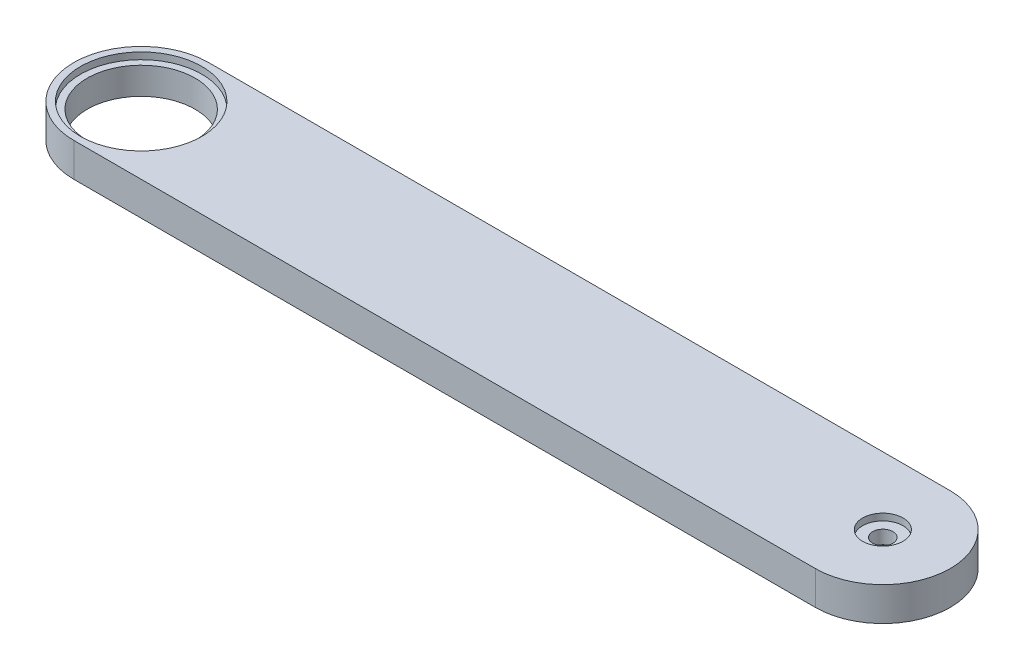
ISO-10303-21;
HEADER;
FILE_DESCRIPTION(('STEP AP214'),'2;1');
FILE_NAME('part.step','',(''),(''),'','','');
FILE_SCHEMA(('AUTOMOTIVE_DESIGN { 1 0 10303 214 1 1 1 1 }'));
ENDSEC;
DATA;
#1=APPLICATION_CONTEXT('core data for automotive mechanical design processes');
#2=APPLICATION_PROTOCOL_DEFINITION('international standard','automotive_design',2000,#1);
#3=PRODUCT_CONTEXT('',#1,'mechanical');
#4=PRODUCT('Part','Part','',(#3));
#5=PRODUCT_RELATED_PRODUCT_CATEGORY('part','',(#4));
#6=PRODUCT_DEFINITION_FORMATION('','',#4);
#7=PRODUCT_DEFINITION_CONTEXT('part definition',#1,'design');
#8=PRODUCT_DEFINITION('design','',#6,#7);
#9=PRODUCT_DEFINITION_SHAPE('','',#8);
#10=(LENGTH_UNIT() NAMED_UNIT(*) SI_UNIT(.MILLI.,.METRE.));
#11=(NAMED_UNIT(*) PLANE_ANGLE_UNIT() SI_UNIT($,.RADIAN.));
#12=(NAMED_UNIT(*) SI_UNIT($,.STERADIAN.) SOLID_ANGLE_UNIT());
#13=UNCERTAINTY_MEASURE_WITH_UNIT(LENGTH_MEASURE(1.E-05),#10,'distance_accuracy_value','');
#14=(GEOMETRIC_REPRESENTATION_CONTEXT(3) GLOBAL_UNCERTAINTY_ASSIGNED_CONTEXT((#13)) GLOBAL_UNIT_ASSIGNED_CONTEXT((#10,
#11,#12)) REPRESENTATION_CONTEXT('',''));
#15=CARTESIAN_POINT('',(0.,0.,0.));
#16=DIRECTION('',(0.,0.,1.));
#17=DIRECTION('',(1.,0.,0.));
#18=AXIS2_PLACEMENT_3D('',#15,#16,#17);
#19=CARTESIAN_POINT('',(-60.,0.,0.));
#20=DIRECTION('',(0.,1.,0.));
#21=DIRECTION('',(0.,0.,1.));
#22=AXIS2_PLACEMENT_3D('',#19,#20,#21);
#23=CYLINDRICAL_SURFACE('',#22,8.);
#24=CARTESIAN_POINT('',(-60.,0.,0.));
#25=DIRECTION('',(0.,1.,0.));
#26=DIRECTION('',(0.,0.,1.));
#27=AXIS2_PLACEMENT_3D('',#24,#25,#26);
#28=CIRCLE('',#27,8.);
#29=CARTESIAN_POINT('',(-60.,0.,8.));
#30=VERTEX_POINT('',#29);
#31=EDGE_CURVE('E130',#30,#30,#28,.T.);
#32=ORIENTED_EDGE('',*,*,#31,.F.);
#33=EDGE_LOOP('',(#32));
#34=FACE_BOUND('',#33,.T.);
#35=CARTESIAN_POINT('',(-60.,4.,0.));
#36=DIRECTION('',(0.,1.,0.));
#37=DIRECTION('',(0.,0.,1.));
#38=AXIS2_PLACEMENT_3D('',#35,#36,#37);
#39=CIRCLE('',#38,8.);
#40=CARTESIAN_POINT('',(-60.,4.,8.));
#41=VERTEX_POINT('',#40);
#42=EDGE_CURVE('E127',#41,#41,#39,.F.);
#43=ORIENTED_EDGE('',*,*,#42,.F.);
#44=EDGE_LOOP('',(#43));
#45=FACE_BOUND('',#44,.T.);
#46=ADVANCED_FACE('F41',(#34,#45),#23,.F.);
#47=CARTESIAN_POINT('',(50.,5.,0.));
#48=DIRECTION('',(0.,-1.,0.));
#49=DIRECTION('',(0.,0.,-1.));
#50=AXIS2_PLACEMENT_3D('',#47,#48,#49);
#51=CYLINDRICAL_SURFACE('',#50,10.);
#52=CARTESIAN_POINT('',(50.,0.,0.));
#53=DIRECTION('',(0.,1.,0.));
#54=DIRECTION('',(0.,0.,1.));
#55=AXIS2_PLACEMENT_3D('',#52,#53,#54);
#56=CIRCLE('',#55,10.);
#57=CARTESIAN_POINT('',(50.,0.,10.));
#58=VERTEX_POINT('',#57);
#59=CARTESIAN_POINT('',(50.,0.,-10.));
#60=VERTEX_POINT('',#59);
#61=EDGE_CURVE('E113',#58,#60,#56,.T.);
#62=ORIENTED_EDGE('',*,*,#61,.T.);
#63=DIRECTION('',(0.,-1.,0.));
#64=VECTOR('',#63,1.);
#65=CARTESIAN_POINT('',(50.,5.,-10.));
#66=LINE('',#65,#64);
#67=CARTESIAN_POINT('',(50.,5.,-10.));
#68=VERTEX_POINT('',#67);
#69=EDGE_CURVE('E11',#68,#60,#66,.T.);
#70=ORIENTED_EDGE('',*,*,#69,.F.);
#71=CARTESIAN_POINT('',(50.,5.,0.));
#72=DIRECTION('',(0.,1.,0.));
#73=DIRECTION('',(0.,0.,1.));
#74=AXIS2_PLACEMENT_3D('',#71,#72,#73);
#75=CIRCLE('',#74,10.);
#76=CARTESIAN_POINT('',(50.,5.,10.));
#77=VERTEX_POINT('',#76);
#78=EDGE_CURVE('E96',#77,#68,#75,.T.);
#79=ORIENTED_EDGE('',*,*,#78,.F.);
#80=DIRECTION('',(0.,-1.,0.));
#81=VECTOR('',#80,1.);
#82=CARTESIAN_POINT('',(50.,5.,10.));
#83=LINE('',#82,#81);
#84=EDGE_CURVE('E109',#77,#58,#83,.T.);
#85=ORIENTED_EDGE('',*,*,#84,.T.);
#86=EDGE_LOOP('',(#62,#70,#79,#85));
#87=FACE_BOUND('',#86,.T.);
#88=ADVANCED_FACE('F43',(#87),#51,.T.);
#89=CARTESIAN_POINT('',(-50.,5.,-10.));
#90=DIRECTION('',(0.,0.,1.));
#91=DIRECTION('',(1.,0.,0.));
#92=AXIS2_PLACEMENT_3D('',#89,#90,#91);
#93=PLANE('',#92);
#94=DIRECTION('',(-1.,0.,0.));
#95=VECTOR('',#94,1.);
#96=CARTESIAN_POINT('',(-50.,0.,-10.));
#97=LINE('',#96,#95);
#98=CARTESIAN_POINT('',(-60.,0.,-10.));
#99=VERTEX_POINT('',#98);
#100=EDGE_CURVE('E101',#60,#99,#97,.T.);
#101=ORIENTED_EDGE('',*,*,#100,.T.);
#102=DIRECTION('',(0.,-1.,0.));
#103=VECTOR('',#102,1.);
#104=CARTESIAN_POINT('',(-60.,5.,-10.));
#105=LINE('',#104,#103);
#106=CARTESIAN_POINT('',(-60.,5.,-10.));
#107=VERTEX_POINT('',#106);
#108=EDGE_CURVE('E52',#107,#99,#105,.T.);
#109=ORIENTED_EDGE('',*,*,#108,.F.);
#110=DIRECTION('',(-1.,0.,0.));
#111=VECTOR('',#110,1.);
#112=CARTESIAN_POINT('',(-50.,5.,-10.));
#113=LINE('',#112,#111);
#114=EDGE_CURVE('E91',#68,#107,#113,.T.);
#115=ORIENTED_EDGE('',*,*,#114,.F.);
#116=ORIENTED_EDGE('',*,*,#69,.T.);
#117=EDGE_LOOP('',(#101,#109,#115,#116));
#118=FACE_BOUND('',#117,.T.);
#119=ADVANCED_FACE('F100',(#118),#93,.F.);
#120=CARTESIAN_POINT('',(-60.,5.,0.));
#121=DIRECTION('',(0.,-1.,0.));
#122=DIRECTION('',(0.,0.,-1.));
#123=AXIS2_PLACEMENT_3D('',#120,#121,#122);
#124=CYLINDRICAL_SURFACE('',#123,10.);
#125=CARTESIAN_POINT('',(-60.,0.,0.));
#126=DIRECTION('',(0.,1.,0.));
#127=DIRECTION('',(0.,0.,1.));
#128=AXIS2_PLACEMENT_3D('',#125,#126,#127);
#129=CIRCLE('',#128,10.);
#130=CARTESIAN_POINT('',(-60.,0.,10.));
#131=VERTEX_POINT('',#130);
#132=EDGE_CURVE('E78',#99,#131,#129,.T.);
#133=ORIENTED_EDGE('',*,*,#132,.T.);
#134=DIRECTION('',(0.,-1.,0.));
#135=VECTOR('',#134,1.);
#136=CARTESIAN_POINT('',(-60.,5.,10.));
#137=LINE('',#136,#135);
#138=CARTESIAN_POINT('',(-60.,5.,10.));
#139=VERTEX_POINT('',#138);
#140=EDGE_CURVE('E103',#139,#131,#137,.T.);
#141=ORIENTED_EDGE('',*,*,#140,.F.);
#142=CARTESIAN_POINT('',(-60.,5.,0.));
#143=DIRECTION('',(0.,1.,0.));
#144=DIRECTION('',(0.,0.,1.));
#145=AXIS2_PLACEMENT_3D('',#142,#143,#144);
#146=CIRCLE('',#145,10.);
#147=EDGE_CURVE('E94',#107,#139,#146,.T.);
#148=ORIENTED_EDGE('',*,*,#147,.F.);
#149=ORIENTED_EDGE('',*,*,#108,.T.);
#150=EDGE_LOOP('',(#133,#141,#148,#149));
#151=FACE_BOUND('',#150,.T.);
#152=ADVANCED_FACE('F105',(#151),#124,.T.);
#153=CARTESIAN_POINT('',(-60.,5.,10.));
#154=DIRECTION('',(0.,0.,-1.));
#155=DIRECTION('',(-1.,0.,0.));
#156=AXIS2_PLACEMENT_3D('',#153,#154,#155);
#157=PLANE('',#156);
#158=DIRECTION('',(1.,0.,0.));
#159=VECTOR('',#158,1.);
#160=CARTESIAN_POINT('',(-60.,0.,10.));
#161=LINE('',#160,#159);
#162=EDGE_CURVE('E84',#131,#58,#161,.T.);
#163=ORIENTED_EDGE('',*,*,#162,.T.);
#164=ORIENTED_EDGE('',*,*,#84,.F.);
#165=DIRECTION('',(1.,0.,0.));
#166=VECTOR('',#165,1.);
#167=CARTESIAN_POINT('',(-60.,5.,10.));
#168=LINE('',#167,#166);
#169=EDGE_CURVE('E61',#139,#77,#168,.T.);
#170=ORIENTED_EDGE('',*,*,#169,.F.);
#171=ORIENTED_EDGE('',*,*,#140,.T.);
#172=EDGE_LOOP('',(#163,#164,#170,#171));
#173=FACE_BOUND('',#172,.T.);
#174=ADVANCED_FACE('F175',(#173),#157,.F.);
#175=CARTESIAN_POINT('',(50.,5.,0.));
#176=DIRECTION('',(0.,1.,0.));
#177=DIRECTION('',(0.,0.,1.));
#178=AXIS2_PLACEMENT_3D('',#175,#176,#177);
#179=PLANE('',#178);
#180=CARTESIAN_POINT('',(-60.,5.,0.));
#181=DIRECTION('',(0.,1.,0.));
#182=DIRECTION('',(0.,0.,1.));
#183=AXIS2_PLACEMENT_3D('',#180,#181,#182);
#184=CIRCLE('',#183,9.);
#185=CARTESIAN_POINT('',(-60.,5.,9.00000000000001));
#186=VERTEX_POINT('',#185);
#187=EDGE_CURVE('E140',#186,#186,#184,.T.);
#188=ORIENTED_EDGE('',*,*,#187,.F.);
#189=EDGE_LOOP('',(#188));
#190=FACE_BOUND('',#189,.T.);
#191=CARTESIAN_POINT('',(50.,5.,0.));
#192=DIRECTION('',(0.,1.,0.));
#193=DIRECTION('',(0.,0.,1.));
#194=AXIS2_PLACEMENT_3D('',#191,#192,#193);
#195=CIRCLE('',#194,3.);
#196=CARTESIAN_POINT('',(50.,5.,3.));
#197=VERTEX_POINT('',#196);
#198=EDGE_CURVE('E137',#197,#197,#195,.T.);
#199=ORIENTED_EDGE('',*,*,#198,.F.);
#200=EDGE_LOOP('',(#199));
#201=FACE_BOUND('',#200,.T.);
#202=ORIENTED_EDGE('',*,*,#78,.T.);
#203=ORIENTED_EDGE('',*,*,#114,.T.);
#204=ORIENTED_EDGE('',*,*,#147,.T.);
#205=ORIENTED_EDGE('',*,*,#169,.T.);
#206=EDGE_LOOP('',(#202,#203,#204,#205));
#207=FACE_BOUND('',#206,.T.);
#208=ADVANCED_FACE('F92',(#190,#201,#207),#179,.T.);
#209=CARTESIAN_POINT('',(50.,0.,0.));
#210=DIRECTION('',(0.,1.,0.));
#211=DIRECTION('',(0.,0.,1.));
#212=AXIS2_PLACEMENT_3D('',#209,#210,#211);
#213=PLANE('',#212);
#214=ORIENTED_EDGE('',*,*,#31,.T.);
#215=EDGE_LOOP('',(#214));
#216=FACE_BOUND('',#215,.T.);
#217=CARTESIAN_POINT('',(50.,0.,0.));
#218=DIRECTION('',(0.,-1.,0.));
#219=DIRECTION('',(0.,0.,-1.));
#220=AXIS2_PLACEMENT_3D('',#217,#218,#219);
#221=CIRCLE('',#220,4.);
#222=CARTESIAN_POINT('',(50.,0.,-4.));
#223=VERTEX_POINT('',#222);
#224=EDGE_CURVE('E154',#223,#223,#221,.T.);
#225=ORIENTED_EDGE('',*,*,#224,.F.);
#226=EDGE_LOOP('',(#225));
#227=FACE_BOUND('',#226,.T.);
#228=ORIENTED_EDGE('',*,*,#61,.F.);
#229=ORIENTED_EDGE('',*,*,#162,.F.);
#230=ORIENTED_EDGE('',*,*,#132,.F.);
#231=ORIENTED_EDGE('',*,*,#100,.F.);
#232=EDGE_LOOP('',(#228,#229,#230,#231));
#233=FACE_BOUND('',#232,.T.);
#234=ADVANCED_FACE('F168',(#216,#227,#233),#213,.F.);
#235=CARTESIAN_POINT('',(50.,2.,0.));
#236=DIRECTION('',(0.,-1.,0.));
#237=DIRECTION('',(0.,0.,-1.));
#238=AXIS2_PLACEMENT_3D('',#235,#236,#237);
#239=CYLINDRICAL_SURFACE('',#238,4.);
#240=CARTESIAN_POINT('',(50.,2.,0.));
#241=DIRECTION('',(0.,-1.,0.));
#242=DIRECTION('',(0.,0.,-1.));
#243=AXIS2_PLACEMENT_3D('',#240,#241,#242);
#244=CIRCLE('',#243,4.);
#245=CARTESIAN_POINT('',(50.,2.,-4.));
#246=VERTEX_POINT('',#245);
#247=EDGE_CURVE('E117',#246,#246,#244,.T.);
#248=ORIENTED_EDGE('',*,*,#247,.F.);
#249=EDGE_LOOP('',(#248));
#250=FACE_BOUND('',#249,.T.);
#251=ORIENTED_EDGE('',*,*,#224,.T.);
#252=EDGE_LOOP('',(#251));
#253=FACE_BOUND('',#252,.T.);
#254=ADVANCED_FACE('F166',(#250,#253),#239,.F.);
#255=CARTESIAN_POINT('',(0.,2.,0.));
#256=DIRECTION('',(0.,-1.,0.));
#257=DIRECTION('',(0.,0.,-1.));
#258=AXIS2_PLACEMENT_3D('',#255,#256,#257);
#259=PLANE('',#258);
#260=CARTESIAN_POINT('',(50.,2.,0.));
#261=DIRECTION('',(0.,-1.,0.));
#262=DIRECTION('',(0.,0.,-1.));
#263=AXIS2_PLACEMENT_3D('',#260,#261,#262);
#264=CIRCLE('',#263,1.5);
#265=CARTESIAN_POINT('',(50.,2.,-1.5));
#266=VERTEX_POINT('',#265);
#267=EDGE_CURVE('E45',#266,#266,#264,.T.);
#268=ORIENTED_EDGE('',*,*,#267,.F.);
#269=EDGE_LOOP('',(#268));
#270=FACE_BOUND('',#269,.T.);
#271=ORIENTED_EDGE('',*,*,#247,.T.);
#272=EDGE_LOOP('',(#271));
#273=FACE_BOUND('',#272,.T.);
#274=ADVANCED_FACE('F205',(#270,#273),#259,.T.);
#275=CARTESIAN_POINT('',(50.,4.,0.));
#276=DIRECTION('',(0.,1.,0.));
#277=DIRECTION('',(0.,0.,1.));
#278=AXIS2_PLACEMENT_3D('',#275,#276,#277);
#279=CYLINDRICAL_SURFACE('',#278,3.);
#280=CARTESIAN_POINT('',(50.,4.,0.));
#281=DIRECTION('',(0.,1.,0.));
#282=DIRECTION('',(0.,0.,1.));
#283=AXIS2_PLACEMENT_3D('',#280,#281,#282);
#284=CIRCLE('',#283,3.);
#285=CARTESIAN_POINT('',(50.,4.,3.));
#286=VERTEX_POINT('',#285);
#287=EDGE_CURVE('E150',#286,#286,#284,.T.);
#288=ORIENTED_EDGE('',*,*,#287,.F.);
#289=EDGE_LOOP('',(#288));
#290=FACE_BOUND('',#289,.T.);
#291=ORIENTED_EDGE('',*,*,#198,.T.);
#292=EDGE_LOOP('',(#291));
#293=FACE_BOUND('',#292,.T.);
#294=ADVANCED_FACE('F201',(#290,#293),#279,.F.);
#295=CARTESIAN_POINT('',(0.,4.,0.));
#296=DIRECTION('',(0.,1.,0.));
#297=DIRECTION('',(0.,0.,1.));
#298=AXIS2_PLACEMENT_3D('',#295,#296,#297);
#299=PLANE('',#298);
#300=CARTESIAN_POINT('',(50.,4.,0.));
#301=DIRECTION('',(0.,1.,0.));
#302=DIRECTION('',(0.,0.,1.));
#303=AXIS2_PLACEMENT_3D('',#300,#301,#302);
#304=CIRCLE('',#303,1.5);
#305=CARTESIAN_POINT('',(50.,4.,1.50000000000001));
#306=VERTEX_POINT('',#305);
#307=EDGE_CURVE('E148',#306,#306,#304,.T.);
#308=ORIENTED_EDGE('',*,*,#307,.F.);
#309=EDGE_LOOP('',(#308));
#310=FACE_BOUND('',#309,.T.);
#311=ORIENTED_EDGE('',*,*,#287,.T.);
#312=EDGE_LOOP('',(#311));
#313=FACE_BOUND('',#312,.T.);
#314=ADVANCED_FACE('F197',(#310,#313),#299,.T.);
#315=CARTESIAN_POINT('',(-60.,4.,0.));
#316=DIRECTION('',(0.,1.,0.));
#317=DIRECTION('',(0.,0.,1.));
#318=AXIS2_PLACEMENT_3D('',#315,#316,#317);
#319=PLANE('',#318);
#320=CARTESIAN_POINT('',(-60.,4.,0.));
#321=DIRECTION('',(0.,1.,0.));
#322=DIRECTION('',(0.,0.,1.));
#323=AXIS2_PLACEMENT_3D('',#320,#321,#322);
#324=CIRCLE('',#323,9.);
#325=CARTESIAN_POINT('',(-60.,4.,9.00000000000001));
#326=VERTEX_POINT('',#325);
#327=EDGE_CURVE('E131',#326,#326,#324,.T.);
#328=ORIENTED_EDGE('',*,*,#327,.T.);
#329=EDGE_LOOP('',(#328));
#330=FACE_BOUND('',#329,.T.);
#331=ORIENTED_EDGE('',*,*,#42,.T.);
#332=EDGE_LOOP('',(#331));
#333=FACE_BOUND('',#332,.T.);
#334=ADVANCED_FACE('F200',(#330,#333),#319,.T.);
#335=CARTESIAN_POINT('',(-60.,4.,0.));
#336=DIRECTION('',(0.,1.,0.));
#337=DIRECTION('',(0.,0.,1.));
#338=AXIS2_PLACEMENT_3D('',#335,#336,#337);
#339=CYLINDRICAL_SURFACE('',#338,9.);
#340=ORIENTED_EDGE('',*,*,#327,.F.);
#341=EDGE_LOOP('',(#340));
#342=FACE_BOUND('',#341,.T.);
#343=ORIENTED_EDGE('',*,*,#187,.T.);
#344=EDGE_LOOP('',(#343));
#345=FACE_BOUND('',#344,.T.);
#346=ADVANCED_FACE('F195',(#342,#345),#339,.F.);
#347=CARTESIAN_POINT('',(50.,0.,0.));
#348=DIRECTION('',(0.,1.,0.));
#349=DIRECTION('',(0.,0.,1.));
#350=AXIS2_PLACEMENT_3D('',#347,#348,#349);
#351=CYLINDRICAL_SURFACE('',#350,1.5);
#352=ORIENTED_EDGE('',*,*,#267,.T.);
#353=EDGE_LOOP('',(#352));
#354=FACE_BOUND('',#353,.T.);
#355=ORIENTED_EDGE('',*,*,#307,.T.);
#356=EDGE_LOOP('',(#355));
#357=FACE_BOUND('',#356,.T.);
#358=ADVANCED_FACE('F243',(#354,#357),#351,.F.);
#359=CLOSED_SHELL('',(#46,#88,#119,#152,#174,#208,#234,#254,#274,#294,#314,#334,#346,#358));
#360=MANIFOLD_SOLID_BREP('B2',#359);
#361=ADVANCED_BREP_SHAPE_REPRESENTATION('',(#18,#360),#14);
#362=SHAPE_DEFINITION_REPRESENTATION(#9,#361);
ENDSEC;
END-ISO-10303-21;
